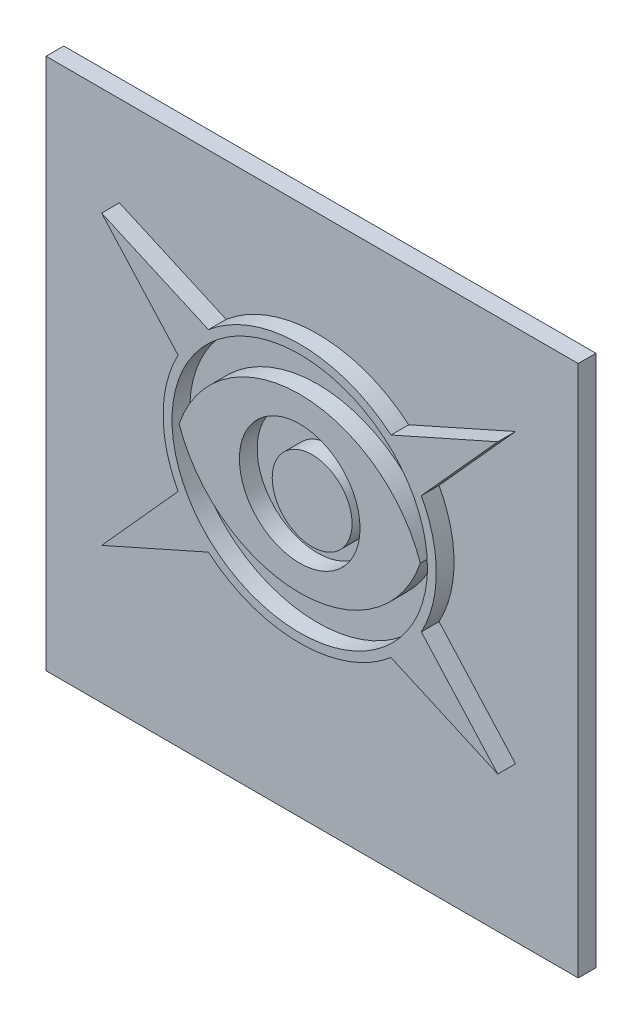
ISO-10303-21;
HEADER;
FILE_DESCRIPTION(('STEP AP214'),'2;1');
FILE_NAME('part.step','',(''),(''),'','','');
FILE_SCHEMA(('AUTOMOTIVE_DESIGN { 1 0 10303 214 1 1 1 1 }'));
ENDSEC;
DATA;
#1=APPLICATION_CONTEXT('core data for automotive mechanical design processes');
#2=APPLICATION_PROTOCOL_DEFINITION('international standard','automotive_design',2000,#1);
#3=PRODUCT_CONTEXT('',#1,'mechanical');
#4=PRODUCT('Part','Part','',(#3));
#5=PRODUCT_RELATED_PRODUCT_CATEGORY('part','',(#4));
#6=PRODUCT_DEFINITION_FORMATION('','',#4);
#7=PRODUCT_DEFINITION_CONTEXT('part definition',#1,'design');
#8=PRODUCT_DEFINITION('design','',#6,#7);
#9=PRODUCT_DEFINITION_SHAPE('','',#8);
#10=(LENGTH_UNIT() NAMED_UNIT(*) SI_UNIT(.MILLI.,.METRE.));
#11=(NAMED_UNIT(*) PLANE_ANGLE_UNIT() SI_UNIT($,.RADIAN.));
#12=(NAMED_UNIT(*) SI_UNIT($,.STERADIAN.) SOLID_ANGLE_UNIT());
#13=UNCERTAINTY_MEASURE_WITH_UNIT(LENGTH_MEASURE(1.E-05),#10,'distance_accuracy_value','');
#14=(GEOMETRIC_REPRESENTATION_CONTEXT(3) GLOBAL_UNCERTAINTY_ASSIGNED_CONTEXT((#13)) GLOBAL_UNIT_ASSIGNED_CONTEXT((#10,
#11,#12)) REPRESENTATION_CONTEXT('',''));
#15=CARTESIAN_POINT('',(0.,0.,0.));
#16=DIRECTION('',(0.,0.,1.));
#17=DIRECTION('',(1.,0.,0.));
#18=AXIS2_PLACEMENT_3D('',#15,#16,#17);
#19=CARTESIAN_POINT('',(0.,0.,10.));
#20=DIRECTION('',(0.,0.,-1.));
#21=DIRECTION('',(-1.,0.,0.));
#22=AXIS2_PLACEMENT_3D('',#19,#20,#21);
#23=PLANE('',#22);
#24=CARTESIAN_POINT('',(160.,168.,10.));
#25=DIRECTION('',(0.,0.,-1.));
#26=DIRECTION('',(-1.,0.,0.));
#27=AXIS2_PLACEMENT_3D('',#24,#25,#26);
#28=CIRCLE('',#27,22.5);
#29=CARTESIAN_POINT('',(137.5,168.,10.));
#30=VERTEX_POINT('',#29);
#31=EDGE_CURVE('E12',#30,#30,#28,.F.);
#32=ORIENTED_EDGE('',*,*,#31,.F.);
#33=EDGE_LOOP('',(#32));
#34=FACE_BOUND('',#33,.T.);
#35=CARTESIAN_POINT('',(153.,168.,10.));
#36=DIRECTION('',(0.,0.,1.));
#37=DIRECTION('',(1.,0.,0.));
#38=AXIS2_PLACEMENT_3D('',#35,#36,#37);
#39=CIRCLE('',#38,34.);
#40=CARTESIAN_POINT('',(187.,168.,10.));
#41=VERTEX_POINT('',#40);
#42=EDGE_CURVE('E286',#41,#41,#39,.T.);
#43=ORIENTED_EDGE('',*,*,#42,.T.);
#44=EDGE_LOOP('',(#43));
#45=FACE_BOUND('',#44,.T.);
#46=ADVANCED_FACE('F137',(#34,#45),#23,.F.);
#47=CARTESIAN_POINT('',(160.,168.,20.));
#48=DIRECTION('',(0.,0.,-1.));
#49=DIRECTION('',(-1.,0.,0.));
#50=AXIS2_PLACEMENT_3D('',#47,#48,#49);
#51=CYLINDRICAL_SURFACE('',#50,22.5);
#52=CARTESIAN_POINT('',(160.,168.,20.));
#53=DIRECTION('',(0.,0.,1.));
#54=DIRECTION('',(1.,0.,0.));
#55=AXIS2_PLACEMENT_3D('',#52,#53,#54);
#56=CIRCLE('',#55,22.5);
#57=CARTESIAN_POINT('',(182.5,168.,20.));
#58=VERTEX_POINT('',#57);
#59=EDGE_CURVE('E517',#58,#58,#56,.T.);
#60=ORIENTED_EDGE('',*,*,#59,.F.);
#61=EDGE_LOOP('',(#60));
#62=FACE_BOUND('',#61,.T.);
#63=ORIENTED_EDGE('',*,*,#31,.T.);
#64=EDGE_LOOP('',(#63));
#65=FACE_BOUND('',#64,.T.);
#66=ADVANCED_FACE('F391',(#62,#65),#51,.T.);
#67=CARTESIAN_POINT('',(0.,0.,20.));
#68=DIRECTION('',(0.,0.,1.));
#69=DIRECTION('',(1.,0.,0.));
#70=AXIS2_PLACEMENT_3D('',#67,#68,#69);
#71=PLANE('',#70);
#72=ORIENTED_EDGE('',*,*,#59,.T.);
#73=EDGE_LOOP('',(#72));
#74=FACE_BOUND('',#73,.T.);
#75=ADVANCED_FACE('F384',(#74),#71,.T.);
#76=CARTESIAN_POINT('',(153.,144.579896907216,20.));
#77=DIRECTION('',(0.,0.,-1.));
#78=DIRECTION('',(-1.,0.,0.));
#79=AXIS2_PLACEMENT_3D('',#76,#77,#78);
#80=CYLINDRICAL_SURFACE('',#79,71.9201030927835);
#81=CARTESIAN_POINT('',(153.,144.579896907216,10.));
#82=DIRECTION('',(0.,0.,1.));
#83=DIRECTION('',(1.,0.,0.));
#84=AXIS2_PLACEMENT_3D('',#81,#82,#83);
#85=CIRCLE('',#84,71.9201030927835);
#86=CARTESIAN_POINT('',(221.,168.,10.));
#87=VERTEX_POINT('',#86);
#88=CARTESIAN_POINT('',(85.,168.,10.));
#89=VERTEX_POINT('',#88);
#90=EDGE_CURVE('E503',#87,#89,#85,.T.);
#91=ORIENTED_EDGE('',*,*,#90,.T.);
#92=DIRECTION('',(0.,0.,-1.));
#93=VECTOR('',#92,1.);
#94=CARTESIAN_POINT('',(85.,168.,20.));
#95=LINE('',#94,#93);
#96=CARTESIAN_POINT('',(85.,168.,20.));
#97=VERTEX_POINT('',#96);
#98=EDGE_CURVE('E513',#97,#89,#95,.T.);
#99=ORIENTED_EDGE('',*,*,#98,.F.);
#100=CARTESIAN_POINT('',(153.,144.579896907216,20.));
#101=DIRECTION('',(0.,0.,1.));
#102=DIRECTION('',(1.,0.,0.));
#103=AXIS2_PLACEMENT_3D('',#100,#101,#102);
#104=CIRCLE('',#103,71.9201030927835);
#105=CARTESIAN_POINT('',(221.,168.,20.));
#106=VERTEX_POINT('',#105);
#107=EDGE_CURVE('E491',#106,#97,#104,.T.);
#108=ORIENTED_EDGE('',*,*,#107,.F.);
#109=DIRECTION('',(0.,0.,-1.));
#110=VECTOR('',#109,1.);
#111=CARTESIAN_POINT('',(221.,168.,20.));
#112=LINE('',#111,#110);
#113=EDGE_CURVE('E499',#106,#87,#112,.T.);
#114=ORIENTED_EDGE('',*,*,#113,.T.);
#115=EDGE_LOOP('',(#91,#99,#108,#114));
#116=FACE_BOUND('',#115,.T.);
#117=ADVANCED_FACE('F381',(#116),#80,.T.);
#118=CARTESIAN_POINT('',(153.,168.,20.));
#119=DIRECTION('',(0.,0.,-1.));
#120=DIRECTION('',(-1.,0.,0.));
#121=AXIS2_PLACEMENT_3D('',#118,#119,#120);
#122=CYLINDRICAL_SURFACE('',#121,34.);
#123=CARTESIAN_POINT('',(153.,168.,20.));
#124=DIRECTION('',(0.,0.,1.));
#125=DIRECTION('',(1.,0.,0.));
#126=AXIS2_PLACEMENT_3D('',#123,#124,#125);
#127=CIRCLE('',#126,34.);
#128=CARTESIAN_POINT('',(187.,168.,20.));
#129=VERTEX_POINT('',#128);
#130=EDGE_CURVE('E487',#129,#129,#127,.T.);
#131=ORIENTED_EDGE('',*,*,#130,.T.);
#132=EDGE_LOOP('',(#131));
#133=FACE_BOUND('',#132,.T.);
#134=ORIENTED_EDGE('',*,*,#42,.F.);
#135=EDGE_LOOP('',(#134));
#136=FACE_BOUND('',#135,.T.);
#137=ADVANCED_FACE('F379',(#133,#136),#122,.F.);
#138=CARTESIAN_POINT('',(153.,191.420103092784,20.));
#139=DIRECTION('',(0.,0.,-1.));
#140=DIRECTION('',(-1.,0.,0.));
#141=AXIS2_PLACEMENT_3D('',#138,#139,#140);
#142=CYLINDRICAL_SURFACE('',#141,71.9201030927835);
#143=CARTESIAN_POINT('',(153.,191.420103092784,10.));
#144=DIRECTION('',(0.,0.,1.));
#145=DIRECTION('',(1.,0.,0.));
#146=AXIS2_PLACEMENT_3D('',#143,#144,#145);
#147=CIRCLE('',#146,71.9201030927835);
#148=EDGE_CURVE('E492',#89,#87,#147,.T.);
#149=ORIENTED_EDGE('',*,*,#148,.T.);
#150=ORIENTED_EDGE('',*,*,#113,.F.);
#151=CARTESIAN_POINT('',(153.,191.420103092784,20.));
#152=DIRECTION('',(0.,0.,1.));
#153=DIRECTION('',(1.,0.,0.));
#154=AXIS2_PLACEMENT_3D('',#151,#152,#153);
#155=CIRCLE('',#154,71.9201030927835);
#156=EDGE_CURVE('E496',#97,#106,#155,.T.);
#157=ORIENTED_EDGE('',*,*,#156,.F.);
#158=ORIENTED_EDGE('',*,*,#98,.T.);
#159=EDGE_LOOP('',(#149,#150,#157,#158));
#160=FACE_BOUND('',#159,.T.);
#161=ADVANCED_FACE('F375',(#160),#142,.T.);
#162=CARTESIAN_POINT('',(0.,0.,20.));
#163=DIRECTION('',(0.,0.,1.));
#164=DIRECTION('',(1.,0.,0.));
#165=AXIS2_PLACEMENT_3D('',#162,#163,#164);
#166=PLANE('',#165);
#167=ORIENTED_EDGE('',*,*,#130,.F.);
#168=EDGE_LOOP('',(#167));
#169=FACE_BOUND('',#168,.T.);
#170=ORIENTED_EDGE('',*,*,#107,.T.);
#171=ORIENTED_EDGE('',*,*,#156,.T.);
#172=EDGE_LOOP('',(#170,#171));
#173=FACE_BOUND('',#172,.T.);
#174=ADVANCED_FACE('F371',(#169,#173),#166,.T.);
#175=CARTESIAN_POINT('',(225.,168.,10.));
#176=CARTESIAN_POINT('',(225.,176.864581058271,10.));
#177=CARTESIAN_POINT('',(221.284259046874,194.593743174812,10.));
#178=CARTESIAN_POINT('',(205.346766644768,217.229416349964,10.));
#179=CARTESIAN_POINT('',(181.371826698268,232.430212201944,10.));
#180=CARTESIAN_POINT('',(153.,237.784893899028,10.));
#181=CARTESIAN_POINT('',(129.111476079877,233.276356497972,10.));
#182=CARTESIAN_POINT('',(112.21215813253,224.593414956131,10.));
#183=CARTESIAN_POINT('',(102.642030230624,216.993953421436,10.));
#184=CARTESIAN_POINT('',(95.9234680431078,209.682344585216,10.));
#185=CARTESIAN_POINT('',(90.1264337925963,201.707291074595,10.));
#186=CARTESIAN_POINT('',(83.288319579693,188.170345196642,10.));
#187=CARTESIAN_POINT('',(79.3506350961925,167.005143483301,10.));
#188=CARTESIAN_POINT('',(84.715740953126,141.406256825189,10.));
#189=CARTESIAN_POINT('',(100.653233355232,118.770583650036,10.));
#190=CARTESIAN_POINT('',(124.628173301732,103.569787798056,10.));
#191=CARTESIAN_POINT('',(153.,98.2151061009722,10.));
#192=CARTESIAN_POINT('',(181.371826698268,103.569787798056,10.));
#193=CARTESIAN_POINT('',(205.346766644768,118.770583650036,10.));
#194=CARTESIAN_POINT('',(221.284259046874,141.406256825188,10.));
#195=CARTESIAN_POINT('',(225.,159.135418941729,10.));
#196=CARTESIAN_POINT('',(225.,168.,10.));
#197=B_SPLINE_CURVE_WITH_KNOTS('',3,(#175,#176,#177,#178,#179,#180,#181,#182,#183,#184,#185,
#186,#187,#188,#189,#190,#191,#192,#193,#194,#195,#196),.UNSPECIFIED.,.T.,.F.,(4,1,1,1,1,1,1,1,
1,1,1,1,1,1,1,1,1,1,1,4),(0.,0.392699081698724,0.785398163397448,1.17809724509617,
1.5707963267949,1.96349540849362,2.1700321148178,2.36638165566716,2.48149881087291,
2.59661596607865,2.79296550692802,3.14159265358979,3.53429173528852,3.92699081698724,
4.31968989868597,4.71238898038469,5.10508806208341,5.49778714378214,5.89048622548086,
6.28318530717959),.UNSPECIFIED.);
#198=CARTESIAN_POINT('',(225.,168.,10.));
#199=VERTEX_POINT('',#198);
#200=EDGE_CURVE('E276',#199,#199,#197,.T.);
#201=ORIENTED_EDGE('',*,*,#200,.T.);
#202=EDGE_LOOP('',(#201));
#203=FACE_BOUND('',#202,.T.);
#204=ORIENTED_EDGE('',*,*,#90,.F.);
#205=ORIENTED_EDGE('',*,*,#148,.F.);
#206=EDGE_LOOP('',(#204,#205));
#207=FACE_BOUND('',#206,.T.);
#208=ADVANCED_FACE('F374',(#203,#207),#23,.F.);
#209=CARTESIAN_POINT('',(153.,168.,20.));
#210=DIRECTION('',(0.,0.,1.));
#211=DIRECTION('',(1.,0.,0.));
#212=AXIS2_PLACEMENT_3D('',#209,#210,#211);
#213=ELLIPSE('',#212,77.,73.);
#214=DIRECTION('',(0.,0.,-1.));
#215=VECTOR('',#214,1.);
#216=SURFACE_OF_LINEAR_EXTRUSION('',#213,#215);
#217=CARTESIAN_POINT('',(153.,168.,10.));
#218=DIRECTION('',(0.,0.,1.));
#219=DIRECTION('',(1.,0.,0.));
#220=AXIS2_PLACEMENT_3D('',#217,#218,#219);
#221=ELLIPSE('',#220,77.,73.);
#222=CARTESIAN_POINT('',(204.448257063639,222.313339624121,10.));
#223=VERTEX_POINT('',#222);
#224=CARTESIAN_POINT('',(101.551742936361,222.313339624121,10.));
#225=VERTEX_POINT('',#224);
#226=EDGE_CURVE('E283',#223,#225,#221,.T.);
#227=ORIENTED_EDGE('',*,*,#226,.T.);
#228=DIRECTION('',(0.,0.,-1.));
#229=VECTOR('',#228,1.);
#230=CARTESIAN_POINT('',(101.551742936361,222.313339624121,20.));
#231=LINE('',#230,#229);
#232=CARTESIAN_POINT('',(101.551742936361,222.313339624121,20.));
#233=VERTEX_POINT('',#232);
#234=EDGE_CURVE('E281',#233,#225,#231,.T.);
#235=ORIENTED_EDGE('',*,*,#234,.F.);
#236=CARTESIAN_POINT('',(204.448257063639,222.313339624121,20.));
#237=VERTEX_POINT('',#236);
#238=EDGE_CURVE('E262',#237,#233,#213,.T.);
#239=ORIENTED_EDGE('',*,*,#238,.F.);
#240=DIRECTION('',(0.,0.,-1.));
#241=VECTOR('',#240,1.);
#242=CARTESIAN_POINT('',(204.448257063639,222.313339624121,20.));
#243=LINE('',#242,#241);
#244=EDGE_CURVE('E324',#237,#223,#243,.T.);
#245=ORIENTED_EDGE('',*,*,#244,.T.);
#246=EDGE_LOOP('',(#227,#235,#239,#245));
#247=FACE_BOUND('',#246,.T.);
#248=ADVANCED_FACE('F282',(#247),#216,.F.);
#249=CARTESIAN_POINT('',(99.4056857924107,223.268825824919,20.));
#250=DIRECTION('',(0.406736643075806,0.913545457642599,0.));
#251=DIRECTION('',(-0.913545457642599,0.406736643075806,0.));
#252=AXIS2_PLACEMENT_3D('',#249,#250,#251);
#253=PLANE('',#252);
#254=DIRECTION('',(0.913545457642599,-0.406736643075806,0.));
#255=VECTOR('',#254,1.);
#256=CARTESIAN_POINT('',(99.4056857924107,223.268825824919,10.));
#257=LINE('',#256,#255);
#258=CARTESIAN_POINT('',(41.355654776257,249.114364816361,10.));
#259=VERTEX_POINT('',#258);
#260=EDGE_CURVE('E153',#259,#225,#257,.T.);
#261=ORIENTED_EDGE('',*,*,#260,.F.);
#262=DIRECTION('',(0.,0.,-1.));
#263=VECTOR('',#262,1.);
#264=CARTESIAN_POINT('',(41.355654776257,249.114364816361,20.));
#265=LINE('',#264,#263);
#266=CARTESIAN_POINT('',(41.355654776257,249.114364816361,20.));
#267=VERTEX_POINT('',#266);
#268=EDGE_CURVE('E287',#267,#259,#265,.T.);
#269=ORIENTED_EDGE('',*,*,#268,.F.);
#270=DIRECTION('',(0.913545457642599,-0.406736643075806,0.));
#271=VECTOR('',#270,1.);
#272=CARTESIAN_POINT('',(99.4056857924107,223.268825824919,20.));
#273=LINE('',#272,#271);
#274=EDGE_CURVE('E268',#267,#233,#273,.T.);
#275=ORIENTED_EDGE('',*,*,#274,.T.);
#276=ORIENTED_EDGE('',*,*,#234,.T.);
#277=EDGE_LOOP('',(#261,#269,#275,#276));
#278=FACE_BOUND('',#277,.T.);
#279=ADVANCED_FACE('F289',(#278),#253,.T.);
#280=CARTESIAN_POINT('',(146.714094039039,132.101963628245,20.));
#281=DIRECTION('',(-0.743144825477392,-0.669130606358861,0.));
#282=DIRECTION('',(0.669130606358861,-0.743144825477392,0.));
#283=AXIS2_PLACEMENT_3D('',#280,#281,#282);
#284=PLANE('',#283);
#285=DIRECTION('',(-0.669130606358861,0.743144825477392,0.));
#286=VECTOR('',#285,1.);
#287=CARTESIAN_POINT('',(146.714094039039,132.101963628245,10.));
#288=LINE('',#287,#286);
#289=CARTESIAN_POINT('',(84.451742425476,201.251310532963,10.));
#290=VERTEX_POINT('',#289);
#291=EDGE_CURVE('E158',#290,#259,#288,.T.);
#292=ORIENTED_EDGE('',*,*,#291,.F.);
#293=DIRECTION('',(0.,0.,-1.));
#294=VECTOR('',#293,1.);
#295=CARTESIAN_POINT('',(84.4517424254759,201.251310532963,20.));
#296=LINE('',#295,#294);
#297=CARTESIAN_POINT('',(84.4517424254759,201.251310532963,20.));
#298=VERTEX_POINT('',#297);
#299=EDGE_CURVE('E481',#298,#290,#296,.T.);
#300=ORIENTED_EDGE('',*,*,#299,.F.);
#301=DIRECTION('',(-0.669130606358861,0.743144825477392,0.));
#302=VECTOR('',#301,1.);
#303=CARTESIAN_POINT('',(146.714094039039,132.101963628245,20.));
#304=LINE('',#303,#302);
#305=EDGE_CURVE('E291',#298,#267,#304,.T.);
#306=ORIENTED_EDGE('',*,*,#305,.T.);
#307=ORIENTED_EDGE('',*,*,#268,.T.);
#308=EDGE_LOOP('',(#292,#300,#306,#307));
#309=FACE_BOUND('',#308,.T.);
#310=ADVANCED_FACE('F365',(#309),#284,.T.);
#311=CARTESIAN_POINT('',(84.451742425476,134.748689467037,10.));
#312=VERTEX_POINT('',#311);
#313=EDGE_CURVE('E438',#290,#312,#221,.T.);
#314=ORIENTED_EDGE('',*,*,#313,.T.);
#315=DIRECTION('',(0.,0.,-1.));
#316=VECTOR('',#315,1.);
#317=CARTESIAN_POINT('',(84.451742425476,134.748689467037,20.));
#318=LINE('',#317,#316);
#319=CARTESIAN_POINT('',(84.451742425476,134.748689467037,20.));
#320=VERTEX_POINT('',#319);
#321=EDGE_CURVE('E477',#320,#312,#318,.T.);
#322=ORIENTED_EDGE('',*,*,#321,.F.);
#323=EDGE_CURVE('E279',#298,#320,#213,.T.);
#324=ORIENTED_EDGE('',*,*,#323,.F.);
#325=ORIENTED_EDGE('',*,*,#299,.T.);
#326=EDGE_LOOP('',(#314,#322,#324,#325));
#327=FACE_BOUND('',#326,.T.);
#328=ADVANCED_FACE('F363',(#327),#216,.F.);
#329=CARTESIAN_POINT('',(-20.3655843828312,18.3372545427903,20.));
#330=DIRECTION('',(0.743144825477392,-0.669130606358861,0.));
#331=DIRECTION('',(0.669130606358861,0.743144825477392,0.));
#332=AXIS2_PLACEMENT_3D('',#329,#330,#331);
#333=PLANE('',#332);
#334=DIRECTION('',(-0.669130606358861,-0.743144825477392,0.));
#335=VECTOR('',#334,1.);
#336=CARTESIAN_POINT('',(-20.3655843828312,18.3372545427903,10.));
#337=LINE('',#336,#335);
#338=CARTESIAN_POINT('',(41.3556547762571,86.8856351836389,10.));
#339=VERTEX_POINT('',#338);
#340=EDGE_CURVE('E580',#312,#339,#337,.T.);
#341=ORIENTED_EDGE('',*,*,#340,.T.);
#342=DIRECTION('',(0.,0.,-1.));
#343=VECTOR('',#342,1.);
#344=CARTESIAN_POINT('',(41.3556547762571,86.8856351836389,20.));
#345=LINE('',#344,#343);
#346=CARTESIAN_POINT('',(41.3556547762571,86.8856351836389,20.));
#347=VERTEX_POINT('',#346);
#348=EDGE_CURVE('E473',#347,#339,#345,.T.);
#349=ORIENTED_EDGE('',*,*,#348,.F.);
#350=DIRECTION('',(-0.669130606358861,-0.743144825477392,0.));
#351=VECTOR('',#350,1.);
#352=CARTESIAN_POINT('',(-20.3655843828312,18.3372545427903,20.));
#353=LINE('',#352,#351);
#354=EDGE_CURVE('E297',#320,#347,#353,.T.);
#355=ORIENTED_EDGE('',*,*,#354,.F.);
#356=ORIENTED_EDGE('',*,*,#321,.T.);
#357=EDGE_LOOP('',(#341,#349,#355,#356));
#358=FACE_BOUND('',#357,.T.);
#359=ADVANCED_FACE('F359',(#358),#333,.F.);
#360=CARTESIAN_POINT('',(-25.4426448877928,57.1451160433679,20.));
#361=DIRECTION('',(-0.406736643075806,0.913545457642599,0.));
#362=DIRECTION('',(-0.913545457642599,-0.406736643075806,0.));
#363=AXIS2_PLACEMENT_3D('',#360,#361,#362);
#364=PLANE('',#363);
#365=DIRECTION('',(0.913545457642599,0.406736643075806,0.));
#366=VECTOR('',#365,1.);
#367=CARTESIAN_POINT('',(-25.4426448877928,57.1451160433679,10.));
#368=LINE('',#367,#366);
#369=CARTESIAN_POINT('',(101.551742936361,113.686660375879,10.));
#370=VERTEX_POINT('',#369);
#371=EDGE_CURVE('E584',#339,#370,#368,.T.);
#372=ORIENTED_EDGE('',*,*,#371,.T.);
#373=DIRECTION('',(0.,0.,-1.));
#374=VECTOR('',#373,1.);
#375=CARTESIAN_POINT('',(101.551742936361,113.686660375879,20.));
#376=LINE('',#375,#374);
#377=CARTESIAN_POINT('',(101.551742936361,113.686660375879,20.));
#378=VERTEX_POINT('',#377);
#379=EDGE_CURVE('E469',#378,#370,#376,.T.);
#380=ORIENTED_EDGE('',*,*,#379,.F.);
#381=DIRECTION('',(0.913545457642599,0.406736643075806,0.));
#382=VECTOR('',#381,1.);
#383=CARTESIAN_POINT('',(-25.4426448877928,57.1451160433679,20.));
#384=LINE('',#383,#382);
#385=EDGE_CURVE('E300',#347,#378,#384,.T.);
#386=ORIENTED_EDGE('',*,*,#385,.F.);
#387=ORIENTED_EDGE('',*,*,#348,.T.);
#388=EDGE_LOOP('',(#372,#380,#386,#387));
#389=FACE_BOUND('',#388,.T.);
#390=ADVANCED_FACE('F356',(#389),#364,.F.);
#391=CARTESIAN_POINT('',(204.448257063639,113.686660375879,10.));
#392=VERTEX_POINT('',#391);
#393=EDGE_CURVE('E588',#370,#392,#221,.T.);
#394=ORIENTED_EDGE('',*,*,#393,.T.);
#395=DIRECTION('',(0.,0.,-1.));
#396=VECTOR('',#395,1.);
#397=CARTESIAN_POINT('',(204.448257063639,113.686660375879,20.));
#398=LINE('',#397,#396);
#399=CARTESIAN_POINT('',(204.448257063639,113.686660375879,20.));
#400=VERTEX_POINT('',#399);
#401=EDGE_CURVE('E465',#400,#392,#398,.T.);
#402=ORIENTED_EDGE('',*,*,#401,.F.);
#403=EDGE_CURVE('E303',#378,#400,#213,.T.);
#404=ORIENTED_EDGE('',*,*,#403,.F.);
#405=ORIENTED_EDGE('',*,*,#379,.T.);
#406=EDGE_LOOP('',(#394,#402,#404,#405));
#407=FACE_BOUND('',#406,.T.);
#408=ADVANCED_FACE('F348',(#407),#216,.F.);
#409=CARTESIAN_POINT('',(76.0656621148888,170.84627434141,20.));
#410=DIRECTION('',(-0.406736643075805,-0.913545457642599,0.));
#411=DIRECTION('',(0.913545457642599,-0.406736643075805,0.));
#412=AXIS2_PLACEMENT_3D('',#409,#410,#411);
#413=PLANE('',#412);
#414=DIRECTION('',(-0.913545457642599,0.406736643075805,0.));
#415=VECTOR('',#414,1.);
#416=CARTESIAN_POINT('',(76.0656621148888,170.84627434141,10.));
#417=LINE('',#416,#415);
#418=CARTESIAN_POINT('',(264.644345223743,86.885635183639,10.));
#419=VERTEX_POINT('',#418);
#420=EDGE_CURVE('E589',#419,#392,#417,.T.);
#421=ORIENTED_EDGE('',*,*,#420,.F.);
#422=DIRECTION('',(0.,0.,-1.));
#423=VECTOR('',#422,1.);
#424=CARTESIAN_POINT('',(264.644345223743,86.885635183639,20.));
#425=LINE('',#424,#423);
#426=CARTESIAN_POINT('',(264.644345223743,86.885635183639,20.));
#427=VERTEX_POINT('',#426);
#428=EDGE_CURVE('E461',#427,#419,#425,.T.);
#429=ORIENTED_EDGE('',*,*,#428,.F.);
#430=DIRECTION('',(-0.913545457642599,0.406736643075805,0.));
#431=VECTOR('',#430,1.);
#432=CARTESIAN_POINT('',(76.0656621148888,170.84627434141,20.));
#433=LINE('',#432,#431);
#434=EDGE_CURVE('E304',#427,#400,#433,.T.);
#435=ORIENTED_EDGE('',*,*,#434,.T.);
#436=ORIENTED_EDGE('',*,*,#401,.T.);
#437=EDGE_LOOP('',(#421,#429,#435,#436));
#438=FACE_BOUND('',#437,.T.);
#439=ADVANCED_FACE('F351',(#438),#413,.T.);
#440=CARTESIAN_POINT('',(189.358439262781,170.499104534136,20.));
#441=DIRECTION('',(0.743144825477392,0.669130606358861,0.));
#442=DIRECTION('',(-0.669130606358861,0.743144825477392,0.));
#443=AXIS2_PLACEMENT_3D('',#440,#441,#442);
#444=PLANE('',#443);
#445=DIRECTION('',(0.669130606358861,-0.743144825477392,0.));
#446=VECTOR('',#445,1.);
#447=CARTESIAN_POINT('',(189.358439262781,170.499104534136,10.));
#448=LINE('',#447,#446);
#449=CARTESIAN_POINT('',(221.548257574524,134.748689467037,10.));
#450=VERTEX_POINT('',#449);
#451=EDGE_CURVE('E592',#450,#419,#448,.T.);
#452=ORIENTED_EDGE('',*,*,#451,.F.);
#453=DIRECTION('',(0.,0.,-1.));
#454=VECTOR('',#453,1.);
#455=CARTESIAN_POINT('',(221.548257574524,134.748689467037,20.));
#456=LINE('',#455,#454);
#457=CARTESIAN_POINT('',(221.548257574524,134.748689467037,20.));
#458=VERTEX_POINT('',#457);
#459=EDGE_CURVE('E457',#458,#450,#456,.T.);
#460=ORIENTED_EDGE('',*,*,#459,.F.);
#461=DIRECTION('',(0.669130606358861,-0.743144825477392,0.));
#462=VECTOR('',#461,1.);
#463=CARTESIAN_POINT('',(189.358439262781,170.499104534136,20.));
#464=LINE('',#463,#462);
#465=EDGE_CURVE('E308',#458,#427,#464,.T.);
#466=ORIENTED_EDGE('',*,*,#465,.T.);
#467=ORIENTED_EDGE('',*,*,#428,.T.);
#468=EDGE_LOOP('',(#452,#460,#466,#467));
#469=FACE_BOUND('',#468,.T.);
#470=ADVANCED_FACE('F346',(#469),#444,.T.);
#471=CARTESIAN_POINT('',(221.548257574524,201.251310532963,10.));
#472=VERTEX_POINT('',#471);
#473=EDGE_CURVE('E437',#450,#472,#221,.T.);
#474=ORIENTED_EDGE('',*,*,#473,.T.);
#475=DIRECTION('',(0.,0.,-1.));
#476=VECTOR('',#475,1.);
#477=CARTESIAN_POINT('',(221.548257574524,201.251310532963,20.));
#478=LINE('',#477,#476);
#479=CARTESIAN_POINT('',(221.548257574524,201.251310532963,20.));
#480=VERTEX_POINT('',#479);
#481=EDGE_CURVE('E448',#480,#472,#478,.T.);
#482=ORIENTED_EDGE('',*,*,#481,.F.);
#483=EDGE_CURVE('E278',#458,#480,#213,.T.);
#484=ORIENTED_EDGE('',*,*,#483,.F.);
#485=ORIENTED_EDGE('',*,*,#459,.T.);
#486=EDGE_LOOP('',(#474,#482,#484,#485));
#487=FACE_BOUND('',#486,.T.);
#488=ADVANCED_FACE('F342',(#487),#216,.F.);
#489=CARTESIAN_POINT('',(22.278760840911,-20.0598863631007,20.));
#490=DIRECTION('',(-0.743144825477392,0.669130606358861,0.));
#491=DIRECTION('',(-0.669130606358861,-0.743144825477392,0.));
#492=AXIS2_PLACEMENT_3D('',#489,#490,#491);
#493=PLANE('',#492);
#494=DIRECTION('',(0.669130606358861,0.743144825477392,0.));
#495=VECTOR('',#494,1.);
#496=CARTESIAN_POINT('',(22.278760840911,-20.0598863631007,10.));
#497=LINE('',#496,#495);
#498=CARTESIAN_POINT('',(264.644345223743,249.114364816361,10.));
#499=VERTEX_POINT('',#498);
#500=EDGE_CURVE('E443',#472,#499,#497,.T.);
#501=ORIENTED_EDGE('',*,*,#500,.T.);
#502=DIRECTION('',(0.,0.,-1.));
#503=VECTOR('',#502,1.);
#504=CARTESIAN_POINT('',(264.644345223743,249.114364816361,20.));
#505=LINE('',#504,#503);
#506=CARTESIAN_POINT('',(264.644345223743,249.114364816361,20.));
#507=VERTEX_POINT('',#506);
#508=EDGE_CURVE('E441',#507,#499,#505,.T.);
#509=ORIENTED_EDGE('',*,*,#508,.F.);
#510=DIRECTION('',(0.669130606358861,0.743144825477392,0.));
#511=VECTOR('',#510,1.);
#512=CARTESIAN_POINT('',(22.278760840911,-20.0598863631007,20.));
#513=LINE('',#512,#511);
#514=EDGE_CURVE('E312',#480,#507,#513,.T.);
#515=ORIENTED_EDGE('',*,*,#514,.F.);
#516=ORIENTED_EDGE('',*,*,#481,.T.);
#517=EDGE_LOOP('',(#501,#509,#515,#516));
#518=FACE_BOUND('',#517,.T.);
#519=ADVANCED_FACE('F338',(#518),#493,.F.);
#520=CARTESIAN_POINT('',(-48.7826685653147,109.567667526876,20.));
#521=DIRECTION('',(0.406736643075806,-0.913545457642599,0.));
#522=DIRECTION('',(0.913545457642599,0.406736643075806,0.));
#523=AXIS2_PLACEMENT_3D('',#520,#521,#522);
#524=PLANE('',#523);
#525=DIRECTION('',(-0.913545457642599,-0.406736643075805,0.));
#526=VECTOR('',#525,1.);
#527=CARTESIAN_POINT('',(-48.7826685653147,109.567667526876,10.));
#528=LINE('',#527,#526);
#529=EDGE_CURVE('E434',#499,#223,#528,.T.);
#530=ORIENTED_EDGE('',*,*,#529,.T.);
#531=ORIENTED_EDGE('',*,*,#244,.F.);
#532=DIRECTION('',(-0.913545457642599,-0.406736643075805,0.));
#533=VECTOR('',#532,1.);
#534=CARTESIAN_POINT('',(-48.7826685653147,109.567667526876,20.));
#535=LINE('',#534,#533);
#536=EDGE_CURVE('E271',#507,#237,#535,.T.);
#537=ORIENTED_EDGE('',*,*,#536,.F.);
#538=ORIENTED_EDGE('',*,*,#508,.T.);
#539=EDGE_LOOP('',(#530,#531,#537,#538));
#540=FACE_BOUND('',#539,.T.);
#541=ADVANCED_FACE('F334',(#540),#524,.F.);
#542=CARTESIAN_POINT('',(225.,168.,20.));
#543=CARTESIAN_POINT('',(225.,176.864581058271,20.));
#544=CARTESIAN_POINT('',(221.284259046874,194.593743174812,20.));
#545=CARTESIAN_POINT('',(205.346766644768,217.229416349964,20.));
#546=CARTESIAN_POINT('',(181.371826698268,232.430212201944,20.));
#547=CARTESIAN_POINT('',(153.,237.784893899028,20.));
#548=CARTESIAN_POINT('',(129.111476079877,233.276356497972,20.));
#549=CARTESIAN_POINT('',(112.21215813253,224.593414956131,20.));
#550=CARTESIAN_POINT('',(102.642030230624,216.993953421436,20.));
#551=CARTESIAN_POINT('',(95.9234680431078,209.682344585216,20.));
#552=CARTESIAN_POINT('',(90.1264337925963,201.707291074595,20.));
#553=CARTESIAN_POINT('',(83.288319579693,188.170345196642,20.));
#554=CARTESIAN_POINT('',(79.3506350961925,167.005143483301,20.));
#555=CARTESIAN_POINT('',(84.715740953126,141.406256825189,20.));
#556=CARTESIAN_POINT('',(100.653233355232,118.770583650036,20.));
#557=CARTESIAN_POINT('',(124.628173301732,103.569787798056,20.));
#558=CARTESIAN_POINT('',(153.,98.2151061009722,20.));
#559=CARTESIAN_POINT('',(181.371826698268,103.569787798056,20.));
#560=CARTESIAN_POINT('',(205.346766644768,118.770583650036,20.));
#561=CARTESIAN_POINT('',(221.284259046874,141.406256825188,20.));
#562=CARTESIAN_POINT('',(225.,159.135418941729,20.));
#563=CARTESIAN_POINT('',(225.,168.,20.));
#564=B_SPLINE_CURVE_WITH_KNOTS('',3,(#542,#543,#544,#545,#546,#547,#548,#549,#550,#551,#552,
#553,#554,#555,#556,#557,#558,#559,#560,#561,#562,#563),.UNSPECIFIED.,.T.,.F.,(4,1,1,1,1,1,1,1,
1,1,1,1,1,1,1,1,1,1,1,4),(0.,0.392699081698724,0.785398163397448,1.17809724509617,
1.5707963267949,1.96349540849362,2.1700321148178,2.36638165566716,2.48149881087291,
2.59661596607865,2.79296550692802,3.14159265358979,3.53429173528852,3.92699081698724,
4.31968989868597,4.71238898038469,5.10508806208341,5.49778714378214,5.89048622548086,
6.28318530717959),.UNSPECIFIED.);
#565=DIRECTION('',(0.,0.,-1.));
#566=VECTOR('',#565,1.);
#567=SURFACE_OF_LINEAR_EXTRUSION('',#564,#566);
#568=CARTESIAN_POINT('',(225.,168.,20.));
#569=VERTEX_POINT('',#568);
#570=EDGE_CURVE('E317',#569,#569,#564,.T.);
#571=ORIENTED_EDGE('',*,*,#570,.T.);
#572=EDGE_LOOP('',(#571));
#573=FACE_BOUND('',#572,.T.);
#574=ORIENTED_EDGE('',*,*,#200,.F.);
#575=EDGE_LOOP('',(#574));
#576=FACE_BOUND('',#575,.T.);
#577=ADVANCED_FACE('F330',(#573,#576),#567,.T.);
#578=CARTESIAN_POINT('',(0.,0.,20.));
#579=DIRECTION('',(0.,0.,1.));
#580=DIRECTION('',(1.,0.,0.));
#581=AXIS2_PLACEMENT_3D('',#578,#579,#580);
#582=PLANE('',#581);
#583=ORIENTED_EDGE('',*,*,#238,.T.);
#584=ORIENTED_EDGE('',*,*,#274,.F.);
#585=ORIENTED_EDGE('',*,*,#305,.F.);
#586=ORIENTED_EDGE('',*,*,#323,.T.);
#587=ORIENTED_EDGE('',*,*,#354,.T.);
#588=ORIENTED_EDGE('',*,*,#385,.T.);
#589=ORIENTED_EDGE('',*,*,#403,.T.);
#590=ORIENTED_EDGE('',*,*,#434,.F.);
#591=ORIENTED_EDGE('',*,*,#465,.F.);
#592=ORIENTED_EDGE('',*,*,#483,.T.);
#593=ORIENTED_EDGE('',*,*,#514,.T.);
#594=ORIENTED_EDGE('',*,*,#536,.T.);
#595=EDGE_LOOP('',(#583,#584,#585,#586,#587,#588,#589,#590,#591,#592,#593,#594));
#596=FACE_BOUND('',#595,.T.);
#597=ORIENTED_EDGE('',*,*,#570,.F.);
#598=EDGE_LOOP('',(#597));
#599=FACE_BOUND('',#598,.T.);
#600=ADVANCED_FACE('F264',(#596,#599),#582,.T.);
#601=CARTESIAN_POINT('',(0.,0.,0.));
#602=DIRECTION('',(0.,0.,-1.));
#603=DIRECTION('',(-1.,0.,0.));
#604=AXIS2_PLACEMENT_3D('',#601,#602,#603);
#605=PLANE('',#604);
#606=DIRECTION('',(0.,-1.,0.));
#607=VECTOR('',#606,1.);
#608=CARTESIAN_POINT('',(0.,0.,0.));
#609=LINE('',#608,#607);
#610=CARTESIAN_POINT('',(0.,300.,0.));
#611=VERTEX_POINT('',#610);
#612=CARTESIAN_POINT('',(0.,0.,0.));
#613=VERTEX_POINT('',#612);
#614=EDGE_CURVE('E521',#611,#613,#609,.T.);
#615=ORIENTED_EDGE('',*,*,#614,.F.);
#616=DIRECTION('',(-1.,0.,0.));
#617=VECTOR('',#616,1.);
#618=CARTESIAN_POINT('',(0.,300.,0.));
#619=LINE('',#618,#617);
#620=CARTESIAN_POINT('',(300.,300.,0.));
#621=VERTEX_POINT('',#620);
#622=EDGE_CURVE('E525',#621,#611,#619,.T.);
#623=ORIENTED_EDGE('',*,*,#622,.F.);
#624=DIRECTION('',(0.,1.,0.));
#625=VECTOR('',#624,1.);
#626=CARTESIAN_POINT('',(300.,0.,0.));
#627=LINE('',#626,#625);
#628=CARTESIAN_POINT('',(300.,0.,0.));
#629=VERTEX_POINT('',#628);
#630=EDGE_CURVE('E541',#629,#621,#627,.T.);
#631=ORIENTED_EDGE('',*,*,#630,.F.);
#632=DIRECTION('',(1.,0.,0.));
#633=VECTOR('',#632,1.);
#634=CARTESIAN_POINT('',(0.,0.,0.));
#635=LINE('',#634,#633);
#636=EDGE_CURVE('E538',#613,#629,#635,.T.);
#637=ORIENTED_EDGE('',*,*,#636,.F.);
#638=EDGE_LOOP('',(#615,#623,#631,#637));
#639=FACE_BOUND('',#638,.T.);
#640=ADVANCED_FACE('F400',(#639),#605,.T.);
#641=CARTESIAN_POINT('',(0.,300.,10.));
#642=DIRECTION('',(0.,-1.,0.));
#643=DIRECTION('',(0.,0.,-1.));
#644=AXIS2_PLACEMENT_3D('',#641,#642,#643);
#645=PLANE('',#644);
#646=ORIENTED_EDGE('',*,*,#622,.T.);
#647=DIRECTION('',(0.,0.,-1.));
#648=VECTOR('',#647,1.);
#649=CARTESIAN_POINT('',(0.,300.,10.));
#650=LINE('',#649,#648);
#651=CARTESIAN_POINT('',(0.,300.,10.));
#652=VERTEX_POINT('',#651);
#653=EDGE_CURVE('E534',#652,#611,#650,.T.);
#654=ORIENTED_EDGE('',*,*,#653,.F.);
#655=DIRECTION('',(-1.,0.,0.));
#656=VECTOR('',#655,1.);
#657=CARTESIAN_POINT('',(0.,300.,10.));
#658=LINE('',#657,#656);
#659=CARTESIAN_POINT('',(300.,300.,10.));
#660=VERTEX_POINT('',#659);
#661=EDGE_CURVE('E531',#660,#652,#658,.T.);
#662=ORIENTED_EDGE('',*,*,#661,.F.);
#663=DIRECTION('',(0.,0.,-1.));
#664=VECTOR('',#663,1.);
#665=CARTESIAN_POINT('',(300.,300.,10.));
#666=LINE('',#665,#664);
#667=EDGE_CURVE('E549',#660,#621,#666,.T.);
#668=ORIENTED_EDGE('',*,*,#667,.T.);
#669=EDGE_LOOP('',(#646,#654,#662,#668));
#670=FACE_BOUND('',#669,.T.);
#671=ADVANCED_FACE('F403',(#670),#645,.F.);
#672=CARTESIAN_POINT('',(300.,0.,10.));
#673=DIRECTION('',(-1.,0.,0.));
#674=DIRECTION('',(0.,0.,1.));
#675=AXIS2_PLACEMENT_3D('',#672,#673,#674);
#676=PLANE('',#675);
#677=ORIENTED_EDGE('',*,*,#630,.T.);
#678=ORIENTED_EDGE('',*,*,#667,.F.);
#679=DIRECTION('',(0.,1.,0.));
#680=VECTOR('',#679,1.);
#681=CARTESIAN_POINT('',(300.,0.,10.));
#682=LINE('',#681,#680);
#683=CARTESIAN_POINT('',(300.,0.,10.));
#684=VERTEX_POINT('',#683);
#685=EDGE_CURVE('E528',#684,#660,#682,.T.);
#686=ORIENTED_EDGE('',*,*,#685,.F.);
#687=DIRECTION('',(0.,0.,-1.));
#688=VECTOR('',#687,1.);
#689=CARTESIAN_POINT('',(300.,0.,10.));
#690=LINE('',#689,#688);
#691=EDGE_CURVE('E553',#684,#629,#690,.T.);
#692=ORIENTED_EDGE('',*,*,#691,.T.);
#693=EDGE_LOOP('',(#677,#678,#686,#692));
#694=FACE_BOUND('',#693,.T.);
#695=ADVANCED_FACE('F407',(#694),#676,.F.);
#696=CARTESIAN_POINT('',(0.,0.,10.));
#697=DIRECTION('',(0.,1.,0.));
#698=DIRECTION('',(0.,0.,1.));
#699=AXIS2_PLACEMENT_3D('',#696,#697,#698);
#700=PLANE('',#699);
#701=ORIENTED_EDGE('',*,*,#636,.T.);
#702=ORIENTED_EDGE('',*,*,#691,.F.);
#703=DIRECTION('',(1.,0.,0.));
#704=VECTOR('',#703,1.);
#705=CARTESIAN_POINT('',(0.,0.,10.));
#706=LINE('',#705,#704);
#707=CARTESIAN_POINT('',(0.,0.,10.));
#708=VERTEX_POINT('',#707);
#709=EDGE_CURVE('E524',#708,#684,#706,.T.);
#710=ORIENTED_EDGE('',*,*,#709,.F.);
#711=DIRECTION('',(0.,0.,-1.));
#712=VECTOR('',#711,1.);
#713=CARTESIAN_POINT('',(0.,0.,10.));
#714=LINE('',#713,#712);
#715=EDGE_CURVE('E146',#708,#613,#714,.T.);
#716=ORIENTED_EDGE('',*,*,#715,.T.);
#717=EDGE_LOOP('',(#701,#702,#710,#716));
#718=FACE_BOUND('',#717,.T.);
#719=ADVANCED_FACE('F410',(#718),#700,.F.);
#720=CARTESIAN_POINT('',(0.,0.,10.));
#721=DIRECTION('',(1.,0.,0.));
#722=DIRECTION('',(0.,0.,-1.));
#723=AXIS2_PLACEMENT_3D('',#720,#721,#722);
#724=PLANE('',#723);
#725=ORIENTED_EDGE('',*,*,#614,.T.);
#726=ORIENTED_EDGE('',*,*,#715,.F.);
#727=DIRECTION('',(0.,-1.,0.));
#728=VECTOR('',#727,1.);
#729=CARTESIAN_POINT('',(0.,0.,10.));
#730=LINE('',#729,#728);
#731=EDGE_CURVE('E431',#652,#708,#730,.T.);
#732=ORIENTED_EDGE('',*,*,#731,.F.);
#733=ORIENTED_EDGE('',*,*,#653,.T.);
#734=EDGE_LOOP('',(#725,#726,#732,#733));
#735=FACE_BOUND('',#734,.T.);
#736=ADVANCED_FACE('F139',(#735),#724,.F.);
#737=ORIENTED_EDGE('',*,*,#731,.T.);
#738=ORIENTED_EDGE('',*,*,#709,.T.);
#739=ORIENTED_EDGE('',*,*,#685,.T.);
#740=ORIENTED_EDGE('',*,*,#661,.T.);
#741=EDGE_LOOP('',(#737,#738,#739,#740));
#742=FACE_BOUND('',#741,.T.);
#743=ORIENTED_EDGE('',*,*,#226,.F.);
#744=ORIENTED_EDGE('',*,*,#529,.F.);
#745=ORIENTED_EDGE('',*,*,#500,.F.);
#746=ORIENTED_EDGE('',*,*,#473,.F.);
#747=ORIENTED_EDGE('',*,*,#451,.T.);
#748=ORIENTED_EDGE('',*,*,#420,.T.);
#749=ORIENTED_EDGE('',*,*,#393,.F.);
#750=ORIENTED_EDGE('',*,*,#371,.F.);
#751=ORIENTED_EDGE('',*,*,#340,.F.);
#752=ORIENTED_EDGE('',*,*,#313,.F.);
#753=ORIENTED_EDGE('',*,*,#291,.T.);
#754=ORIENTED_EDGE('',*,*,#260,.T.);
#755=EDGE_LOOP('',(#743,#744,#745,#746,#747,#748,#749,#750,#751,#752,#753,#754));
#756=FACE_BOUND('',#755,.T.);
#757=ADVANCED_FACE('F399',(#742,#756),#23,.F.);
#758=CLOSED_SHELL('',(#46,#66,#75,#117,#137,#161,#174,#208,#248,#279,#310,#328,#359,#390,#408,
#439,#470,#488,#519,#541,#577,#600,#640,#671,#695,#719,#736,#757));
#759=MANIFOLD_SOLID_BREP('B2',#758);
#760=ADVANCED_BREP_SHAPE_REPRESENTATION('',(#18,#759),#14);
#761=SHAPE_DEFINITION_REPRESENTATION(#9,#760);
ENDSEC;
END-ISO-10303-21;
